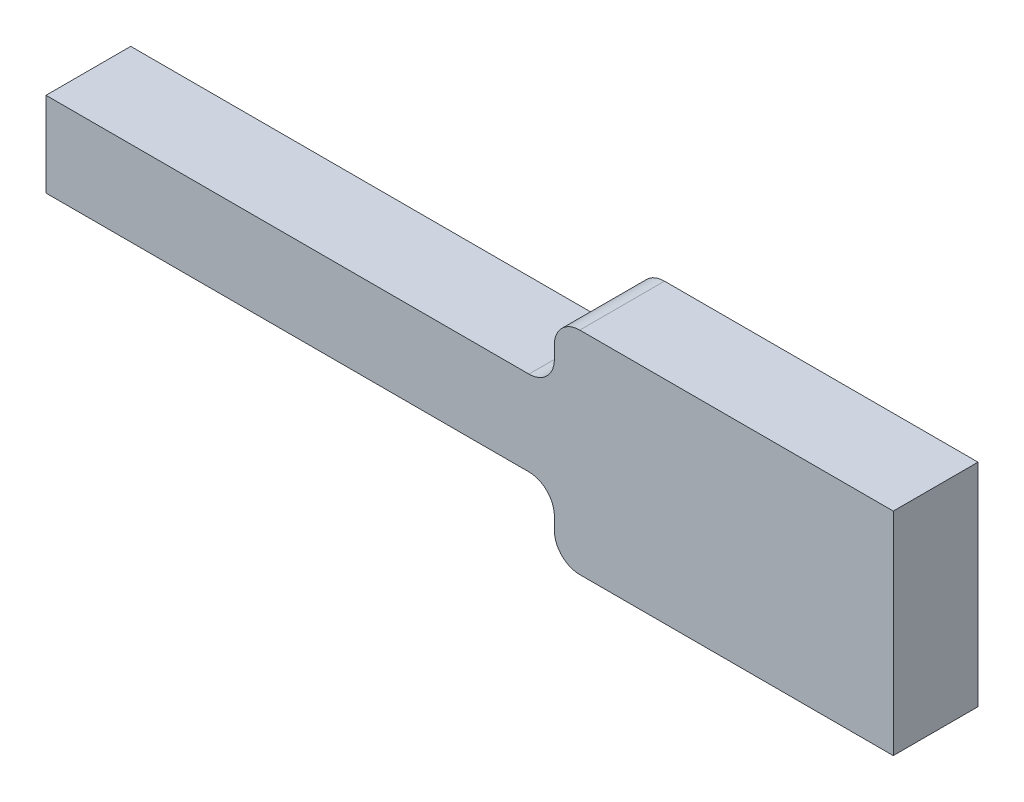
ISO-10303-21;
HEADER;
FILE_DESCRIPTION(('STEP AP214'),'2;1');
FILE_NAME('part.step','',(''),(''),'','','');
FILE_SCHEMA(('AUTOMOTIVE_DESIGN { 1 0 10303 214 1 1 1 1 }'));
ENDSEC;
DATA;
#1=APPLICATION_CONTEXT('core data for automotive mechanical design processes');
#2=APPLICATION_PROTOCOL_DEFINITION('international standard','automotive_design',2000,#1);
#3=PRODUCT_CONTEXT('',#1,'mechanical');
#4=PRODUCT('Part','Part','',(#3));
#5=PRODUCT_RELATED_PRODUCT_CATEGORY('part','',(#4));
#6=PRODUCT_DEFINITION_FORMATION('','',#4);
#7=PRODUCT_DEFINITION_CONTEXT('part definition',#1,'design');
#8=PRODUCT_DEFINITION('design','',#6,#7);
#9=PRODUCT_DEFINITION_SHAPE('','',#8);
#10=(LENGTH_UNIT() NAMED_UNIT(*) SI_UNIT(.MILLI.,.METRE.));
#11=(NAMED_UNIT(*) PLANE_ANGLE_UNIT() SI_UNIT($,.RADIAN.));
#12=(NAMED_UNIT(*) SI_UNIT($,.STERADIAN.) SOLID_ANGLE_UNIT());
#13=UNCERTAINTY_MEASURE_WITH_UNIT(LENGTH_MEASURE(1.E-05),#10,'distance_accuracy_value','');
#14=(GEOMETRIC_REPRESENTATION_CONTEXT(3) GLOBAL_UNCERTAINTY_ASSIGNED_CONTEXT((#13)) GLOBAL_UNIT_ASSIGNED_CONTEXT((#10,
#11,#12)) REPRESENTATION_CONTEXT('',''));
#15=CARTESIAN_POINT('',(0.,0.,0.));
#16=DIRECTION('',(0.,0.,1.));
#17=DIRECTION('',(1.,0.,0.));
#18=AXIS2_PLACEMENT_3D('',#15,#16,#17);
#19=CARTESIAN_POINT('',(50.,12.5,5.));
#20=DIRECTION('',(-1.,0.,0.));
#21=DIRECTION('',(0.,0.,1.));
#22=AXIS2_PLACEMENT_3D('',#19,#20,#21);
#23=PLANE('',#22);
#24=DIRECTION('',(0.,0.,-1.));
#25=VECTOR('',#24,1.);
#26=CARTESIAN_POINT('',(50.,-12.5,5.));
#27=LINE('',#26,#25);
#28=CARTESIAN_POINT('',(50.,-12.5,5.));
#29=VERTEX_POINT('',#28);
#30=CARTESIAN_POINT('',(50.,-12.5,-5.));
#31=VERTEX_POINT('',#30);
#32=EDGE_CURVE('E250',#29,#31,#27,.T.);
#33=ORIENTED_EDGE('',*,*,#32,.T.);
#34=DIRECTION('',(0.,-1.,0.));
#35=VECTOR('',#34,1.);
#36=CARTESIAN_POINT('',(50.,12.5,-5.));
#37=LINE('',#36,#35);
#38=CARTESIAN_POINT('',(50.,12.5,-5.));
#39=VERTEX_POINT('',#38);
#40=EDGE_CURVE('E150',#39,#31,#37,.T.);
#41=ORIENTED_EDGE('',*,*,#40,.F.);
#42=DIRECTION('',(0.,0.,-1.));
#43=VECTOR('',#42,1.);
#44=CARTESIAN_POINT('',(50.,12.5,5.));
#45=LINE('',#44,#43);
#46=CARTESIAN_POINT('',(50.,12.5,5.));
#47=VERTEX_POINT('',#46);
#48=EDGE_CURVE('E241',#47,#39,#45,.T.);
#49=ORIENTED_EDGE('',*,*,#48,.F.);
#50=DIRECTION('',(0.,-1.,0.));
#51=VECTOR('',#50,1.);
#52=CARTESIAN_POINT('',(50.,12.5,5.));
#53=LINE('',#52,#51);
#54=EDGE_CURVE('E156',#47,#29,#53,.T.);
#55=ORIENTED_EDGE('',*,*,#54,.T.);
#56=EDGE_LOOP('',(#33,#41,#49,#55));
#57=FACE_BOUND('',#56,.T.);
#58=ADVANCED_FACE('F33',(#57),#23,.F.);
#59=CARTESIAN_POINT('',(-50.,12.5,-5.));
#60=DIRECTION('',(0.,0.,1.));
#61=DIRECTION('',(1.,0.,0.));
#62=AXIS2_PLACEMENT_3D('',#59,#60,#61);
#63=PLANE('',#62);
#64=DIRECTION('',(0.,1.,0.));
#65=VECTOR('',#64,1.);
#66=CARTESIAN_POINT('',(9.99999999999999,12.5,-5.));
#67=LINE('',#66,#65);
#68=CARTESIAN_POINT('',(9.99999999999999,8.,-5.));
#69=VERTEX_POINT('',#68);
#70=CARTESIAN_POINT('',(9.99999999999999,9.5,-5.));
#71=VERTEX_POINT('',#70);
#72=EDGE_CURVE('E237',#69,#71,#67,.T.);
#73=ORIENTED_EDGE('',*,*,#72,.T.);
#74=CARTESIAN_POINT('',(13.,9.5,-5.));
#75=DIRECTION('',(0.,0.,1.));
#76=DIRECTION('',(1.,0.,0.));
#77=AXIS2_PLACEMENT_3D('',#74,#75,#76);
#78=CIRCLE('',#77,3.);
#79=CARTESIAN_POINT('',(13.,12.5,-5.));
#80=VERTEX_POINT('',#79);
#81=EDGE_CURVE('E176',#71,#80,#78,.F.);
#82=ORIENTED_EDGE('',*,*,#81,.T.);
#83=DIRECTION('',(-1.,0.,0.));
#84=VECTOR('',#83,1.);
#85=CARTESIAN_POINT('',(-50.,12.5,-5.));
#86=LINE('',#85,#84);
#87=EDGE_CURVE('E234',#39,#80,#86,.T.);
#88=ORIENTED_EDGE('',*,*,#87,.F.);
#89=ORIENTED_EDGE('',*,*,#40,.T.);
#90=DIRECTION('',(-1.,0.,0.));
#91=VECTOR('',#90,1.);
#92=CARTESIAN_POINT('',(-50.,-12.5,-5.));
#93=LINE('',#92,#91);
#94=CARTESIAN_POINT('',(13.,-12.5,-5.));
#95=VERTEX_POINT('',#94);
#96=EDGE_CURVE('E252',#31,#95,#93,.T.);
#97=ORIENTED_EDGE('',*,*,#96,.T.);
#98=CARTESIAN_POINT('',(13.,-9.5,-5.));
#99=DIRECTION('',(0.,0.,1.));
#100=DIRECTION('',(1.,0.,0.));
#101=AXIS2_PLACEMENT_3D('',#98,#99,#100);
#102=CIRCLE('',#101,3.);
#103=CARTESIAN_POINT('',(9.99999999999999,-9.5,-5.));
#104=VERTEX_POINT('',#103);
#105=EDGE_CURVE('E174',#95,#104,#102,.F.);
#106=ORIENTED_EDGE('',*,*,#105,.T.);
#107=DIRECTION('',(0.,1.,0.));
#108=VECTOR('',#107,1.);
#109=CARTESIAN_POINT('',(9.99999999999999,-12.5,-5.));
#110=LINE('',#109,#108);
#111=CARTESIAN_POINT('',(9.99999999999999,-8.,-5.));
#112=VERTEX_POINT('',#111);
#113=EDGE_CURVE('E135',#104,#112,#110,.T.);
#114=ORIENTED_EDGE('',*,*,#113,.T.);
#115=CARTESIAN_POINT('',(6.99999999999999,-8.,-5.));
#116=DIRECTION('',(0.,0.,1.));
#117=DIRECTION('',(1.,0.,0.));
#118=AXIS2_PLACEMENT_3D('',#115,#116,#117);
#119=CIRCLE('',#118,3.);
#120=CARTESIAN_POINT('',(6.99999999999999,-5.,-5.));
#121=VERTEX_POINT('',#120);
#122=EDGE_CURVE('E11',#112,#121,#119,.T.);
#123=ORIENTED_EDGE('',*,*,#122,.T.);
#124=DIRECTION('',(-1.,0.,0.));
#125=VECTOR('',#124,1.);
#126=CARTESIAN_POINT('',(-50.,-5.,-5.));
#127=LINE('',#126,#125);
#128=CARTESIAN_POINT('',(-50.,-5.,-5.));
#129=VERTEX_POINT('',#128);
#130=EDGE_CURVE('E123',#121,#129,#127,.T.);
#131=ORIENTED_EDGE('',*,*,#130,.T.);
#132=DIRECTION('',(0.,-1.,0.));
#133=VECTOR('',#132,1.);
#134=CARTESIAN_POINT('',(-50.,12.5,-5.));
#135=LINE('',#134,#133);
#136=CARTESIAN_POINT('',(-50.,5.,-5.));
#137=VERTEX_POINT('',#136);
#138=EDGE_CURVE('E128',#137,#129,#135,.T.);
#139=ORIENTED_EDGE('',*,*,#138,.F.);
#140=DIRECTION('',(1.,0.,0.));
#141=VECTOR('',#140,1.);
#142=CARTESIAN_POINT('',(-50.,5.,-5.));
#143=LINE('',#142,#141);
#144=CARTESIAN_POINT('',(6.99999999999999,5.,-5.));
#145=VERTEX_POINT('',#144);
#146=EDGE_CURVE('E201',#137,#145,#143,.T.);
#147=ORIENTED_EDGE('',*,*,#146,.T.);
#148=CARTESIAN_POINT('',(6.99999999999999,8.,-5.));
#149=DIRECTION('',(0.,0.,1.));
#150=DIRECTION('',(1.,0.,0.));
#151=AXIS2_PLACEMENT_3D('',#148,#149,#150);
#152=CIRCLE('',#151,3.);
#153=EDGE_CURVE('E189',#145,#69,#152,.T.);
#154=ORIENTED_EDGE('',*,*,#153,.T.);
#155=EDGE_LOOP('',(#73,#82,#88,#89,#97,#106,#114,#123,#131,#139,#147,#154));
#156=FACE_BOUND('',#155,.T.);
#157=ADVANCED_FACE('F126',(#156),#63,.F.);
#158=CARTESIAN_POINT('',(-50.,12.5,5.));
#159=DIRECTION('',(1.,0.,0.));
#160=DIRECTION('',(0.,0.,-1.));
#161=AXIS2_PLACEMENT_3D('',#158,#159,#160);
#162=PLANE('',#161);
#163=ORIENTED_EDGE('',*,*,#138,.T.);
#164=DIRECTION('',(0.,0.,1.));
#165=VECTOR('',#164,1.);
#166=CARTESIAN_POINT('',(-50.,-5.,-5.));
#167=LINE('',#166,#165);
#168=CARTESIAN_POINT('',(-50.,-5.,5.));
#169=VERTEX_POINT('',#168);
#170=EDGE_CURVE('E134',#129,#169,#167,.T.);
#171=ORIENTED_EDGE('',*,*,#170,.T.);
#172=DIRECTION('',(0.,-1.,0.));
#173=VECTOR('',#172,1.);
#174=CARTESIAN_POINT('',(-50.,12.5,5.));
#175=LINE('',#174,#173);
#176=CARTESIAN_POINT('',(-50.,5.,5.));
#177=VERTEX_POINT('',#176);
#178=EDGE_CURVE('E151',#177,#169,#175,.T.);
#179=ORIENTED_EDGE('',*,*,#178,.F.);
#180=DIRECTION('',(0.,0.,1.));
#181=VECTOR('',#180,1.);
#182=CARTESIAN_POINT('',(-50.,5.,-5.));
#183=LINE('',#182,#181);
#184=EDGE_CURVE('E149',#137,#177,#183,.T.);
#185=ORIENTED_EDGE('',*,*,#184,.F.);
#186=EDGE_LOOP('',(#163,#171,#179,#185));
#187=FACE_BOUND('',#186,.T.);
#188=ADVANCED_FACE('F147',(#187),#162,.F.);
#189=CARTESIAN_POINT('',(-50.,12.5,5.));
#190=DIRECTION('',(0.,0.,-1.));
#191=DIRECTION('',(-1.,0.,0.));
#192=AXIS2_PLACEMENT_3D('',#189,#190,#191);
#193=PLANE('',#192);
#194=DIRECTION('',(1.,0.,0.));
#195=VECTOR('',#194,1.);
#196=CARTESIAN_POINT('',(-50.,12.5,5.));
#197=LINE('',#196,#195);
#198=CARTESIAN_POINT('',(13.,12.5,5.));
#199=VERTEX_POINT('',#198);
#200=EDGE_CURVE('E243',#199,#47,#197,.T.);
#201=ORIENTED_EDGE('',*,*,#200,.F.);
#202=CARTESIAN_POINT('',(13.,9.5,5.));
#203=DIRECTION('',(0.,0.,-1.));
#204=DIRECTION('',(-1.,0.,0.));
#205=AXIS2_PLACEMENT_3D('',#202,#203,#204);
#206=CIRCLE('',#205,3.);
#207=CARTESIAN_POINT('',(9.99999999999999,9.5,5.));
#208=VERTEX_POINT('',#207);
#209=EDGE_CURVE('E167',#199,#208,#206,.F.);
#210=ORIENTED_EDGE('',*,*,#209,.T.);
#211=DIRECTION('',(0.,-1.,0.));
#212=VECTOR('',#211,1.);
#213=CARTESIAN_POINT('',(9.99999999999999,12.5,5.));
#214=LINE('',#213,#212);
#215=CARTESIAN_POINT('',(9.99999999999999,8.,5.));
#216=VERTEX_POINT('',#215);
#217=EDGE_CURVE('E253',#208,#216,#214,.T.);
#218=ORIENTED_EDGE('',*,*,#217,.T.);
#219=CARTESIAN_POINT('',(6.99999999999999,8.,5.));
#220=DIRECTION('',(0.,0.,-1.));
#221=DIRECTION('',(-1.,0.,0.));
#222=AXIS2_PLACEMENT_3D('',#219,#220,#221);
#223=CIRCLE('',#222,3.);
#224=CARTESIAN_POINT('',(6.99999999999999,5.,5.));
#225=VERTEX_POINT('',#224);
#226=EDGE_CURVE('E187',#216,#225,#223,.T.);
#227=ORIENTED_EDGE('',*,*,#226,.T.);
#228=DIRECTION('',(-1.,0.,0.));
#229=VECTOR('',#228,1.);
#230=CARTESIAN_POINT('',(-50.,5.,5.));
#231=LINE('',#230,#229);
#232=EDGE_CURVE('E154',#225,#177,#231,.T.);
#233=ORIENTED_EDGE('',*,*,#232,.T.);
#234=ORIENTED_EDGE('',*,*,#178,.T.);
#235=DIRECTION('',(1.,0.,0.));
#236=VECTOR('',#235,1.);
#237=CARTESIAN_POINT('',(-50.,-5.,5.));
#238=LINE('',#237,#236);
#239=CARTESIAN_POINT('',(6.99999999999999,-5.,5.));
#240=VERTEX_POINT('',#239);
#241=EDGE_CURVE('E140',#169,#240,#238,.T.);
#242=ORIENTED_EDGE('',*,*,#241,.T.);
#243=CARTESIAN_POINT('',(6.99999999999999,-8.,5.));
#244=DIRECTION('',(0.,0.,-1.));
#245=DIRECTION('',(-1.,0.,0.));
#246=AXIS2_PLACEMENT_3D('',#243,#244,#245);
#247=CIRCLE('',#246,3.);
#248=CARTESIAN_POINT('',(9.99999999999999,-8.,5.));
#249=VERTEX_POINT('',#248);
#250=EDGE_CURVE('E41',#240,#249,#247,.T.);
#251=ORIENTED_EDGE('',*,*,#250,.T.);
#252=DIRECTION('',(0.,-1.,0.));
#253=VECTOR('',#252,1.);
#254=CARTESIAN_POINT('',(9.99999999999999,12.5,5.));
#255=LINE('',#254,#253);
#256=CARTESIAN_POINT('',(9.99999999999999,-9.5,5.));
#257=VERTEX_POINT('',#256);
#258=EDGE_CURVE('E144',#249,#257,#255,.T.);
#259=ORIENTED_EDGE('',*,*,#258,.T.);
#260=CARTESIAN_POINT('',(13.,-9.5,5.));
#261=DIRECTION('',(0.,0.,-1.));
#262=DIRECTION('',(-1.,0.,0.));
#263=AXIS2_PLACEMENT_3D('',#260,#261,#262);
#264=CIRCLE('',#263,3.);
#265=CARTESIAN_POINT('',(13.,-12.5,5.));
#266=VERTEX_POINT('',#265);
#267=EDGE_CURVE('E165',#257,#266,#264,.F.);
#268=ORIENTED_EDGE('',*,*,#267,.T.);
#269=DIRECTION('',(1.,0.,0.));
#270=VECTOR('',#269,1.);
#271=CARTESIAN_POINT('',(-50.,-12.5,5.));
#272=LINE('',#271,#270);
#273=EDGE_CURVE('E246',#266,#29,#272,.T.);
#274=ORIENTED_EDGE('',*,*,#273,.T.);
#275=ORIENTED_EDGE('',*,*,#54,.F.);
#276=EDGE_LOOP('',(#201,#210,#218,#227,#233,#234,#242,#251,#259,#268,#274,#275));
#277=FACE_BOUND('',#276,.T.);
#278=ADVANCED_FACE('F194',(#277),#193,.F.);
#279=CARTESIAN_POINT('',(0.,12.5,0.));
#280=DIRECTION('',(0.,-1.,0.));
#281=DIRECTION('',(0.,0.,-1.));
#282=AXIS2_PLACEMENT_3D('',#279,#280,#281);
#283=PLANE('',#282);
#284=ORIENTED_EDGE('',*,*,#87,.T.);
#285=DIRECTION('',(0.,0.,1.));
#286=VECTOR('',#285,1.);
#287=CARTESIAN_POINT('',(13.,12.5,0.));
#288=LINE('',#287,#286);
#289=EDGE_CURVE('E162',#80,#199,#288,.T.);
#290=ORIENTED_EDGE('',*,*,#289,.T.);
#291=ORIENTED_EDGE('',*,*,#200,.T.);
#292=ORIENTED_EDGE('',*,*,#48,.T.);
#293=EDGE_LOOP('',(#284,#290,#291,#292));
#294=FACE_BOUND('',#293,.T.);
#295=ADVANCED_FACE('F239',(#294),#283,.F.);
#296=CARTESIAN_POINT('',(0.,-12.5,0.));
#297=DIRECTION('',(0.,-1.,0.));
#298=DIRECTION('',(0.,0.,-1.));
#299=AXIS2_PLACEMENT_3D('',#296,#297,#298);
#300=PLANE('',#299);
#301=ORIENTED_EDGE('',*,*,#273,.F.);
#302=DIRECTION('',(0.,0.,1.));
#303=VECTOR('',#302,1.);
#304=CARTESIAN_POINT('',(13.,-12.5,-5.));
#305=LINE('',#304,#303);
#306=EDGE_CURVE('E48',#266,#95,#305,.F.);
#307=ORIENTED_EDGE('',*,*,#306,.T.);
#308=ORIENTED_EDGE('',*,*,#96,.F.);
#309=ORIENTED_EDGE('',*,*,#32,.F.);
#310=EDGE_LOOP('',(#301,#307,#308,#309));
#311=FACE_BOUND('',#310,.T.);
#312=ADVANCED_FACE('F258',(#311),#300,.T.);
#313=CARTESIAN_POINT('',(-50.,5.,-5.));
#314=DIRECTION('',(0.,-1.,0.));
#315=DIRECTION('',(0.,0.,-1.));
#316=AXIS2_PLACEMENT_3D('',#313,#314,#315);
#317=PLANE('',#316);
#318=ORIENTED_EDGE('',*,*,#232,.F.);
#319=DIRECTION('',(0.,0.,1.));
#320=VECTOR('',#319,1.);
#321=CARTESIAN_POINT('',(6.99999999999999,5.,-5.));
#322=LINE('',#321,#320);
#323=EDGE_CURVE('E56',#225,#145,#322,.F.);
#324=ORIENTED_EDGE('',*,*,#323,.T.);
#325=ORIENTED_EDGE('',*,*,#146,.F.);
#326=ORIENTED_EDGE('',*,*,#184,.T.);
#327=EDGE_LOOP('',(#318,#324,#325,#326));
#328=FACE_BOUND('',#327,.T.);
#329=ADVANCED_FACE('F270',(#328),#317,.F.);
#330=CARTESIAN_POINT('',(9.99999999999999,12.5,-5.));
#331=DIRECTION('',(1.,0.,0.));
#332=DIRECTION('',(0.,1.,0.));
#333=AXIS2_PLACEMENT_3D('',#330,#331,#332);
#334=PLANE('',#333);
#335=ORIENTED_EDGE('',*,*,#217,.F.);
#336=DIRECTION('',(0.,0.,1.));
#337=VECTOR('',#336,1.);
#338=CARTESIAN_POINT('',(9.99999999999999,9.5,-5.));
#339=LINE('',#338,#337);
#340=EDGE_CURVE('E172',#208,#71,#339,.F.);
#341=ORIENTED_EDGE('',*,*,#340,.T.);
#342=ORIENTED_EDGE('',*,*,#72,.F.);
#343=DIRECTION('',(0.,0.,1.));
#344=VECTOR('',#343,1.);
#345=CARTESIAN_POINT('',(9.99999999999999,8.,5.));
#346=LINE('',#345,#344);
#347=EDGE_CURVE('E169',#69,#216,#346,.T.);
#348=ORIENTED_EDGE('',*,*,#347,.T.);
#349=EDGE_LOOP('',(#335,#341,#342,#348));
#350=FACE_BOUND('',#349,.T.);
#351=ADVANCED_FACE('F267',(#350),#334,.F.);
#352=CARTESIAN_POINT('',(-50.,-5.,-5.));
#353=DIRECTION('',(0.,1.,0.));
#354=DIRECTION('',(0.,0.,1.));
#355=AXIS2_PLACEMENT_3D('',#352,#353,#354);
#356=PLANE('',#355);
#357=ORIENTED_EDGE('',*,*,#130,.F.);
#358=DIRECTION('',(0.,0.,1.));
#359=VECTOR('',#358,1.);
#360=CARTESIAN_POINT('',(6.99999999999999,-5.,5.));
#361=LINE('',#360,#359);
#362=EDGE_CURVE('E179',#121,#240,#361,.T.);
#363=ORIENTED_EDGE('',*,*,#362,.T.);
#364=ORIENTED_EDGE('',*,*,#241,.F.);
#365=ORIENTED_EDGE('',*,*,#170,.F.);
#366=EDGE_LOOP('',(#357,#363,#364,#365));
#367=FACE_BOUND('',#366,.T.);
#368=ADVANCED_FACE('F138',(#367),#356,.F.);
#369=CARTESIAN_POINT('',(9.99999999999999,-12.5,-5.));
#370=DIRECTION('',(1.,0.,0.));
#371=DIRECTION('',(0.,1.,0.));
#372=AXIS2_PLACEMENT_3D('',#369,#370,#371);
#373=PLANE('',#372);
#374=ORIENTED_EDGE('',*,*,#258,.F.);
#375=DIRECTION('',(0.,0.,1.));
#376=VECTOR('',#375,1.);
#377=CARTESIAN_POINT('',(9.99999999999999,-8.,-5.));
#378=LINE('',#377,#376);
#379=EDGE_CURVE('E184',#249,#112,#378,.F.);
#380=ORIENTED_EDGE('',*,*,#379,.T.);
#381=ORIENTED_EDGE('',*,*,#113,.F.);
#382=DIRECTION('',(0.,0.,1.));
#383=VECTOR('',#382,1.);
#384=CARTESIAN_POINT('',(9.99999999999999,-9.5,5.));
#385=LINE('',#384,#383);
#386=EDGE_CURVE('E181',#104,#257,#385,.T.);
#387=ORIENTED_EDGE('',*,*,#386,.T.);
#388=EDGE_LOOP('',(#374,#380,#381,#387));
#389=FACE_BOUND('',#388,.T.);
#390=ADVANCED_FACE('F198',(#389),#373,.F.);
#391=CARTESIAN_POINT('',(13.,9.5,0.));
#392=DIRECTION('',(0.,0.,1.));
#393=DIRECTION('',(1.,0.,0.));
#394=AXIS2_PLACEMENT_3D('',#391,#392,#393);
#395=CYLINDRICAL_SURFACE('',#394,3.);
#396=ORIENTED_EDGE('',*,*,#81,.F.);
#397=ORIENTED_EDGE('',*,*,#340,.F.);
#398=ORIENTED_EDGE('',*,*,#209,.F.);
#399=ORIENTED_EDGE('',*,*,#289,.F.);
#400=EDGE_LOOP('',(#396,#397,#398,#399));
#401=FACE_BOUND('',#400,.T.);
#402=ADVANCED_FACE('F211',(#401),#395,.T.);
#403=CARTESIAN_POINT('',(6.99999999999999,8.,-5.));
#404=DIRECTION('',(0.,0.,-1.));
#405=DIRECTION('',(-1.,0.,0.));
#406=AXIS2_PLACEMENT_3D('',#403,#404,#405);
#407=CYLINDRICAL_SURFACE('',#406,3.);
#408=ORIENTED_EDGE('',*,*,#153,.F.);
#409=ORIENTED_EDGE('',*,*,#323,.F.);
#410=ORIENTED_EDGE('',*,*,#226,.F.);
#411=ORIENTED_EDGE('',*,*,#347,.F.);
#412=EDGE_LOOP('',(#408,#409,#410,#411));
#413=FACE_BOUND('',#412,.T.);
#414=ADVANCED_FACE('F205',(#413),#407,.F.);
#415=CARTESIAN_POINT('',(6.99999999999999,-8.,-5.));
#416=DIRECTION('',(0.,0.,-1.));
#417=DIRECTION('',(-1.,0.,0.));
#418=AXIS2_PLACEMENT_3D('',#415,#416,#417);
#419=CYLINDRICAL_SURFACE('',#418,3.);
#420=ORIENTED_EDGE('',*,*,#122,.F.);
#421=ORIENTED_EDGE('',*,*,#379,.F.);
#422=ORIENTED_EDGE('',*,*,#250,.F.);
#423=ORIENTED_EDGE('',*,*,#362,.F.);
#424=EDGE_LOOP('',(#420,#421,#422,#423));
#425=FACE_BOUND('',#424,.T.);
#426=ADVANCED_FACE('F203',(#425),#419,.F.);
#427=CARTESIAN_POINT('',(13.,-9.5,-5.));
#428=DIRECTION('',(0.,0.,-1.));
#429=DIRECTION('',(-1.,0.,0.));
#430=AXIS2_PLACEMENT_3D('',#427,#428,#429);
#431=CYLINDRICAL_SURFACE('',#430,3.);
#432=ORIENTED_EDGE('',*,*,#105,.F.);
#433=ORIENTED_EDGE('',*,*,#306,.F.);
#434=ORIENTED_EDGE('',*,*,#267,.F.);
#435=ORIENTED_EDGE('',*,*,#386,.F.);
#436=EDGE_LOOP('',(#432,#433,#434,#435));
#437=FACE_BOUND('',#436,.T.);
#438=ADVANCED_FACE('F35',(#437),#431,.T.);
#439=CLOSED_SHELL('',(#58,#157,#188,#278,#295,#312,#329,#351,#368,#390,#402,#414,#426,#438));
#440=MANIFOLD_SOLID_BREP('B2',#439);
#441=ADVANCED_BREP_SHAPE_REPRESENTATION('',(#18,#440),#14);
#442=SHAPE_DEFINITION_REPRESENTATION(#9,#441);
ENDSEC;
END-ISO-10303-21;
